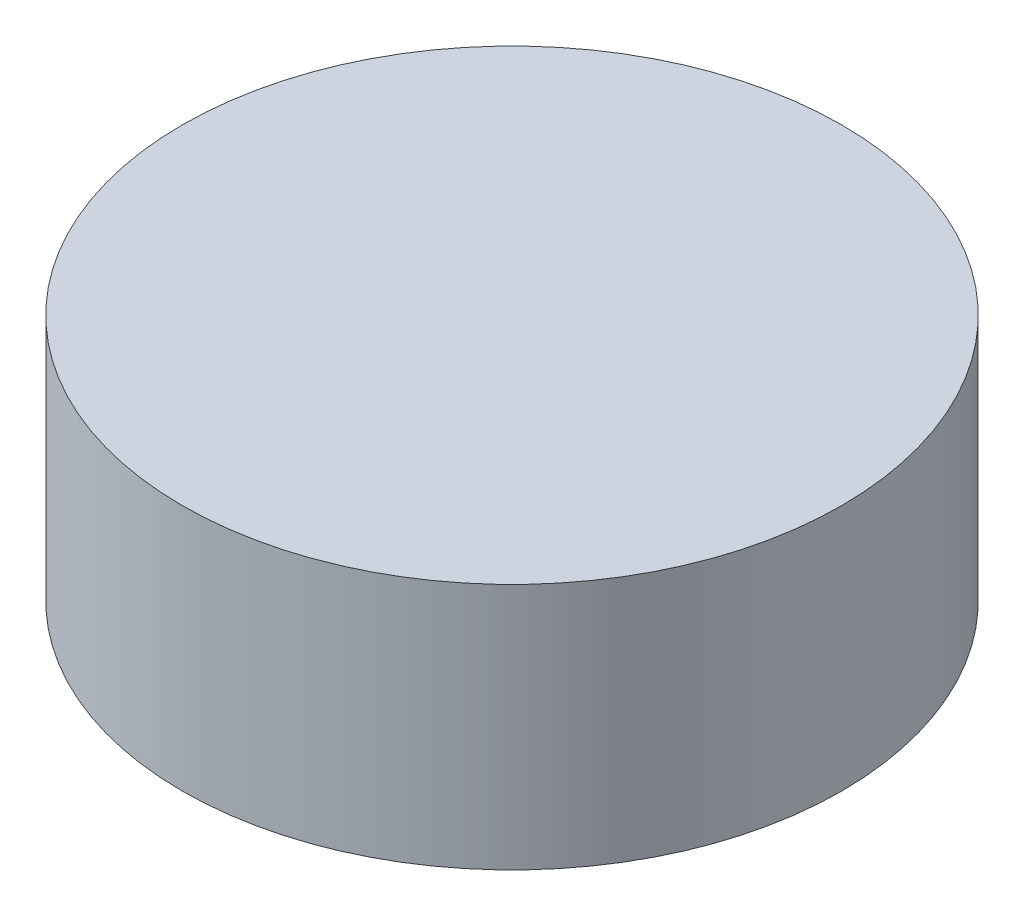
ISO-10303-21;
HEADER;
FILE_DESCRIPTION(('STEP AP214'),'2;1');
FILE_NAME('part.step','',(''),(''),'','','');
FILE_SCHEMA(('AUTOMOTIVE_DESIGN { 1 0 10303 214 1 1 1 1 }'));
ENDSEC;
DATA;
#1=APPLICATION_CONTEXT('core data for automotive mechanical design processes');
#2=APPLICATION_PROTOCOL_DEFINITION('international standard','automotive_design',2000,#1);
#3=PRODUCT_CONTEXT('',#1,'mechanical');
#4=PRODUCT('Part','Part','',(#3));
#5=PRODUCT_RELATED_PRODUCT_CATEGORY('part','',(#4));
#6=PRODUCT_DEFINITION_FORMATION('','',#4);
#7=PRODUCT_DEFINITION_CONTEXT('part definition',#1,'design');
#8=PRODUCT_DEFINITION('design','',#6,#7);
#9=PRODUCT_DEFINITION_SHAPE('','',#8);
#10=(LENGTH_UNIT() NAMED_UNIT(*) SI_UNIT(.MILLI.,.METRE.));
#11=(NAMED_UNIT(*) PLANE_ANGLE_UNIT() SI_UNIT($,.RADIAN.));
#12=(NAMED_UNIT(*) SI_UNIT($,.STERADIAN.) SOLID_ANGLE_UNIT());
#13=UNCERTAINTY_MEASURE_WITH_UNIT(LENGTH_MEASURE(1.E-05),#10,'distance_accuracy_value','');
#14=(GEOMETRIC_REPRESENTATION_CONTEXT(3) GLOBAL_UNCERTAINTY_ASSIGNED_CONTEXT((#13)) GLOBAL_UNIT_ASSIGNED_CONTEXT((#10,
#11,#12)) REPRESENTATION_CONTEXT('',''));
#15=CARTESIAN_POINT('',(0.,0.,0.));
#16=DIRECTION('',(0.,0.,1.));
#17=DIRECTION('',(1.,0.,0.));
#18=AXIS2_PLACEMENT_3D('',#15,#16,#17);
#19=CARTESIAN_POINT('',(0.,19.05,0.));
#20=DIRECTION('',(0.,1.,0.));
#21=DIRECTION('',(0.,0.,1.));
#22=AXIS2_PLACEMENT_3D('',#19,#20,#21);
#23=PLANE('',#22);
#24=CARTESIAN_POINT('',(0.,19.05,0.));
#25=DIRECTION('',(0.,1.,0.));
#26=DIRECTION('',(0.,0.,1.));
#27=AXIS2_PLACEMENT_3D('',#24,#25,#26);
#28=CIRCLE('',#27,25.4);
#29=CARTESIAN_POINT('',(0.,19.05,25.4));
#30=VERTEX_POINT('',#29);
#31=EDGE_CURVE('E18',#30,#30,#28,.F.);
#32=ORIENTED_EDGE('',*,*,#31,.F.);
#33=EDGE_LOOP('',(#32));
#34=FACE_BOUND('',#33,.T.);
#35=ADVANCED_FACE('F15',(#34),#23,.T.);
#36=CARTESIAN_POINT('',(0.,0.,0.));
#37=DIRECTION('',(0.,1.,0.));
#38=DIRECTION('',(0.,0.,1.));
#39=AXIS2_PLACEMENT_3D('',#36,#37,#38);
#40=PLANE('',#39);
#41=CARTESIAN_POINT('',(0.,0.,0.));
#42=DIRECTION('',(0.,1.,0.));
#43=DIRECTION('',(0.,0.,1.));
#44=AXIS2_PLACEMENT_3D('',#41,#42,#43);
#45=CIRCLE('',#44,25.4);
#46=CARTESIAN_POINT('',(0.,0.,25.4));
#47=VERTEX_POINT('',#46);
#48=EDGE_CURVE('E10',#47,#47,#45,.T.);
#49=ORIENTED_EDGE('',*,*,#48,.F.);
#50=EDGE_LOOP('',(#49));
#51=FACE_BOUND('',#50,.T.);
#52=ADVANCED_FACE('F30',(#51),#40,.F.);
#53=CARTESIAN_POINT('',(0.,0.,0.));
#54=DIRECTION('',(0.,1.,0.));
#55=DIRECTION('',(0.,0.,1.));
#56=AXIS2_PLACEMENT_3D('',#53,#54,#55);
#57=CYLINDRICAL_SURFACE('',#56,25.4);
#58=ORIENTED_EDGE('',*,*,#48,.T.);
#59=EDGE_LOOP('',(#58));
#60=FACE_BOUND('',#59,.T.);
#61=ORIENTED_EDGE('',*,*,#31,.T.);
#62=EDGE_LOOP('',(#61));
#63=FACE_BOUND('',#62,.T.);
#64=ADVANCED_FACE('F27',(#60,#63),#57,.T.);
#65=CLOSED_SHELL('',(#35,#52,#64));
#66=MANIFOLD_SOLID_BREP('B1',#65);
#67=ADVANCED_BREP_SHAPE_REPRESENTATION('',(#18,#66),#14);
#68=SHAPE_DEFINITION_REPRESENTATION(#9,#67);
ENDSEC;
END-ISO-10303-21;
